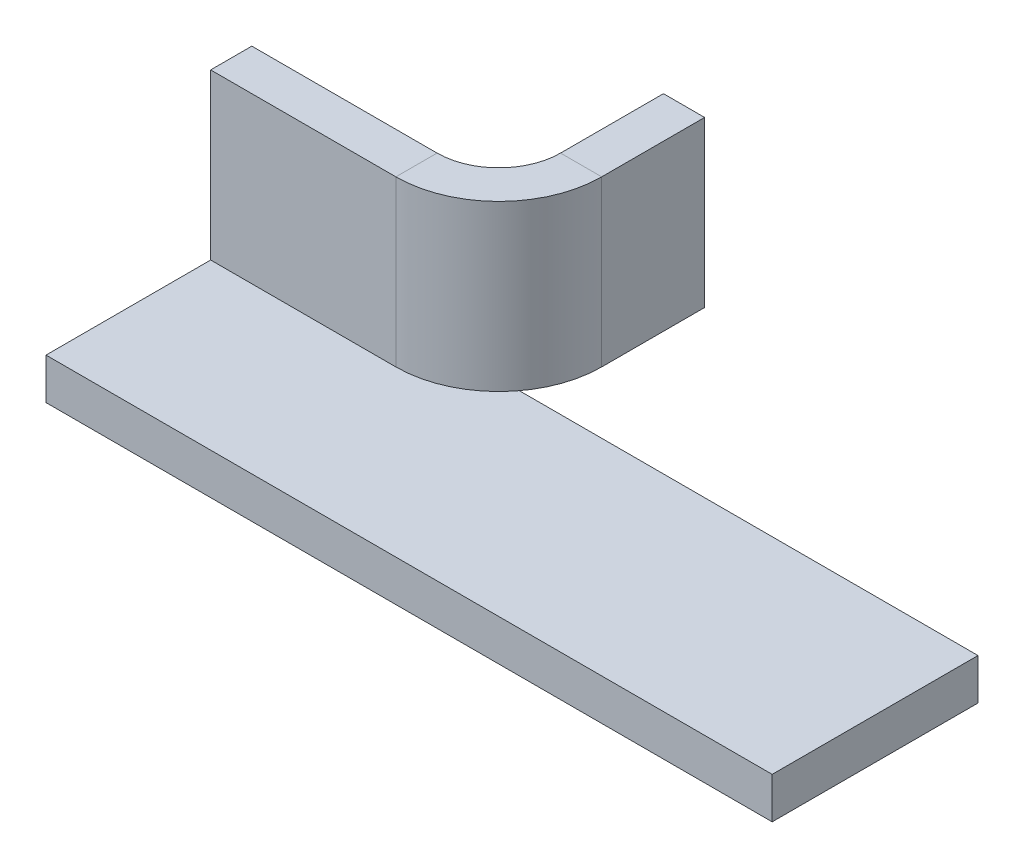
ISO-10303-21;
HEADER;
FILE_DESCRIPTION(('STEP AP214'),'2;1');
FILE_NAME('part.step','',(''),(''),'','','');
FILE_SCHEMA(('AUTOMOTIVE_DESIGN { 1 0 10303 214 1 1 1 1 }'));
ENDSEC;
DATA;
#1=APPLICATION_CONTEXT('core data for automotive mechanical design processes');
#2=APPLICATION_PROTOCOL_DEFINITION('international standard','automotive_design',2000,#1);
#3=PRODUCT_CONTEXT('',#1,'mechanical');
#4=PRODUCT('Part','Part','',(#3));
#5=PRODUCT_RELATED_PRODUCT_CATEGORY('part','',(#4));
#6=PRODUCT_DEFINITION_FORMATION('','',#4);
#7=PRODUCT_DEFINITION_CONTEXT('part definition',#1,'design');
#8=PRODUCT_DEFINITION('design','',#6,#7);
#9=PRODUCT_DEFINITION_SHAPE('','',#8);
#10=(LENGTH_UNIT() NAMED_UNIT(*) SI_UNIT(.MILLI.,.METRE.));
#11=(NAMED_UNIT(*) PLANE_ANGLE_UNIT() SI_UNIT($,.RADIAN.));
#12=(NAMED_UNIT(*) SI_UNIT($,.STERADIAN.) SOLID_ANGLE_UNIT());
#13=UNCERTAINTY_MEASURE_WITH_UNIT(LENGTH_MEASURE(1.E-05),#10,'distance_accuracy_value','');
#14=(GEOMETRIC_REPRESENTATION_CONTEXT(3) GLOBAL_UNCERTAINTY_ASSIGNED_CONTEXT((#13)) GLOBAL_UNIT_ASSIGNED_CONTEXT((#10,
#11,#12)) REPRESENTATION_CONTEXT('',''));
#15=CARTESIAN_POINT('',(0.,0.,0.));
#16=DIRECTION('',(0.,0.,1.));
#17=DIRECTION('',(1.,0.,0.));
#18=AXIS2_PLACEMENT_3D('',#15,#16,#17);
#19=CARTESIAN_POINT('',(12.,8.,-3.));
#20=DIRECTION('',(0.,1.,0.));
#21=DIRECTION('',(0.,0.,1.));
#22=AXIS2_PLACEMENT_3D('',#19,#20,#21);
#23=PLANE('',#22);
#24=DIRECTION('',(1.,0.,0.));
#25=VECTOR('',#24,1.);
#26=CARTESIAN_POINT('',(12.,8.,-3.));
#27=LINE('',#26,#25);
#28=CARTESIAN_POINT('',(12.,8.,-3.));
#29=VERTEX_POINT('',#28);
#30=CARTESIAN_POINT('',(14.,8.,-3.));
#31=VERTEX_POINT('',#30);
#32=EDGE_CURVE('E13',#29,#31,#27,.T.);
#33=ORIENTED_EDGE('',*,*,#32,.F.);
#34=CARTESIAN_POINT('',(9.,8.,-3.));
#35=DIRECTION('',(0.,-1.,0.));
#36=DIRECTION('',(0.,0.,-1.));
#37=AXIS2_PLACEMENT_3D('',#34,#35,#36);
#38=CIRCLE('',#37,3.);
#39=CARTESIAN_POINT('',(9.,8.,0.));
#40=VERTEX_POINT('',#39);
#41=EDGE_CURVE('E151',#40,#29,#38,.F.);
#42=ORIENTED_EDGE('',*,*,#41,.F.);
#43=DIRECTION('',(0.,0.,-1.));
#44=VECTOR('',#43,1.);
#45=CARTESIAN_POINT('',(9.,8.,2.));
#46=LINE('',#45,#44);
#47=CARTESIAN_POINT('',(9.,8.,2.));
#48=VERTEX_POINT('',#47);
#49=EDGE_CURVE('E64',#48,#40,#46,.T.);
#50=ORIENTED_EDGE('',*,*,#49,.F.);
#51=CARTESIAN_POINT('',(9.,8.,-3.));
#52=DIRECTION('',(0.,1.,0.));
#53=DIRECTION('',(1.,0.,0.));
#54=AXIS2_PLACEMENT_3D('',#51,#52,#53);
#55=CIRCLE('',#54,5.);
#56=EDGE_CURVE('E143',#48,#31,#55,.T.);
#57=ORIENTED_EDGE('',*,*,#56,.T.);
#58=EDGE_LOOP('',(#33,#42,#50,#57));
#59=FACE_BOUND('',#58,.T.);
#60=ADVANCED_FACE('F54',(#59),#23,.T.);
#61=CARTESIAN_POINT('',(9.,8.,2.));
#62=DIRECTION('',(0.,1.,0.));
#63=DIRECTION('',(0.,0.,1.));
#64=AXIS2_PLACEMENT_3D('',#61,#62,#63);
#65=PLANE('',#64);
#66=DIRECTION('',(0.,0.,-1.));
#67=VECTOR('',#66,1.);
#68=CARTESIAN_POINT('',(12.,8.,0.));
#69=LINE('',#68,#67);
#70=CARTESIAN_POINT('',(12.,8.,-8.));
#71=VERTEX_POINT('',#70);
#72=EDGE_CURVE('E201',#29,#71,#69,.T.);
#73=ORIENTED_EDGE('',*,*,#72,.F.);
#74=ORIENTED_EDGE('',*,*,#32,.T.);
#75=DIRECTION('',(0.,0.,-1.));
#76=VECTOR('',#75,1.);
#77=CARTESIAN_POINT('',(14.,8.,0.));
#78=LINE('',#77,#76);
#79=CARTESIAN_POINT('',(14.,8.,-8.));
#80=VERTEX_POINT('',#79);
#81=EDGE_CURVE('E111',#31,#80,#78,.T.);
#82=ORIENTED_EDGE('',*,*,#81,.T.);
#83=DIRECTION('',(1.,0.,0.));
#84=VECTOR('',#83,1.);
#85=CARTESIAN_POINT('',(12.,8.,-8.));
#86=LINE('',#85,#84);
#87=EDGE_CURVE('E356',#71,#80,#86,.T.);
#88=ORIENTED_EDGE('',*,*,#87,.F.);
#89=EDGE_LOOP('',(#73,#74,#82,#88));
#90=FACE_BOUND('',#89,.T.);
#91=ADVANCED_FACE('F209',(#90),#65,.T.);
#92=CARTESIAN_POINT('',(9.,0.,0.));
#93=DIRECTION('',(0.,-1.,0.));
#94=DIRECTION('',(0.,0.,-1.));
#95=AXIS2_PLACEMENT_3D('',#92,#93,#94);
#96=PLANE('',#95);
#97=DIRECTION('',(0.,0.,1.));
#98=VECTOR('',#97,1.);
#99=CARTESIAN_POINT('',(9.,0.,0.));
#100=LINE('',#99,#98);
#101=CARTESIAN_POINT('',(9.,0.,0.));
#102=VERTEX_POINT('',#101);
#103=CARTESIAN_POINT('',(9.,0.,2.));
#104=VERTEX_POINT('',#103);
#105=EDGE_CURVE('E96',#102,#104,#100,.T.);
#106=ORIENTED_EDGE('',*,*,#105,.F.);
#107=CARTESIAN_POINT('',(9.,0.,-3.));
#108=DIRECTION('',(0.,-1.,0.));
#109=DIRECTION('',(0.,0.,-1.));
#110=AXIS2_PLACEMENT_3D('',#107,#108,#109);
#111=CIRCLE('',#110,3.);
#112=CARTESIAN_POINT('',(12.,0.,-3.));
#113=VERTEX_POINT('',#112);
#114=EDGE_CURVE('E170',#102,#113,#111,.F.);
#115=ORIENTED_EDGE('',*,*,#114,.T.);
#116=DIRECTION('',(-1.,0.,0.));
#117=VECTOR('',#116,1.);
#118=CARTESIAN_POINT('',(14.,0.,-3.));
#119=LINE('',#118,#117);
#120=CARTESIAN_POINT('',(14.,0.,-3.));
#121=VERTEX_POINT('',#120);
#122=EDGE_CURVE('E102',#121,#113,#119,.T.);
#123=ORIENTED_EDGE('',*,*,#122,.F.);
#124=CARTESIAN_POINT('',(9.,0.,-3.));
#125=DIRECTION('',(0.,1.,0.));
#126=DIRECTION('',(1.,0.,0.));
#127=AXIS2_PLACEMENT_3D('',#124,#125,#126);
#128=CIRCLE('',#127,5.);
#129=EDGE_CURVE('E172',#104,#121,#128,.T.);
#130=ORIENTED_EDGE('',*,*,#129,.F.);
#131=EDGE_LOOP('',(#106,#115,#123,#130));
#132=FACE_BOUND('',#131,.T.);
#133=ADVANCED_FACE('F210',(#132),#96,.T.);
#134=CARTESIAN_POINT('',(14.,0.,-3.));
#135=DIRECTION('',(0.,-1.,0.));
#136=DIRECTION('',(0.,0.,-1.));
#137=AXIS2_PLACEMENT_3D('',#134,#135,#136);
#138=PLANE('',#137);
#139=DIRECTION('',(1.,0.,0.));
#140=VECTOR('',#139,1.);
#141=CARTESIAN_POINT('',(0.,0.,0.));
#142=LINE('',#141,#140);
#143=CARTESIAN_POINT('',(0.,0.,0.));
#144=VERTEX_POINT('',#143);
#145=EDGE_CURVE('E169',#144,#102,#142,.T.);
#146=ORIENTED_EDGE('',*,*,#145,.T.);
#147=ORIENTED_EDGE('',*,*,#105,.T.);
#148=DIRECTION('',(1.,0.,0.));
#149=VECTOR('',#148,1.);
#150=CARTESIAN_POINT('',(0.,0.,2.));
#151=LINE('',#150,#149);
#152=CARTESIAN_POINT('',(0.,0.,2.));
#153=VERTEX_POINT('',#152);
#154=EDGE_CURVE('E175',#153,#104,#151,.T.);
#155=ORIENTED_EDGE('',*,*,#154,.F.);
#156=DIRECTION('',(0.,0.,-1.));
#157=VECTOR('',#156,1.);
#158=CARTESIAN_POINT('',(0.,0.,2.));
#159=LINE('',#158,#157);
#160=EDGE_CURVE('E135',#153,#144,#159,.T.);
#161=ORIENTED_EDGE('',*,*,#160,.T.);
#162=EDGE_LOOP('',(#146,#147,#155,#161));
#163=FACE_BOUND('',#162,.T.);
#164=ADVANCED_FACE('F204',(#163),#138,.T.);
#165=CARTESIAN_POINT('',(14.,8.,0.));
#166=DIRECTION('',(-1.,0.,0.));
#167=DIRECTION('',(0.,0.,1.));
#168=AXIS2_PLACEMENT_3D('',#165,#166,#167);
#169=PLANE('',#168);
#170=DIRECTION('',(0.,0.,-1.));
#171=VECTOR('',#170,1.);
#172=CARTESIAN_POINT('',(14.,0.,0.));
#173=LINE('',#172,#171);
#174=CARTESIAN_POINT('',(14.,0.,-8.));
#175=VERTEX_POINT('',#174);
#176=EDGE_CURVE('E159',#121,#175,#173,.T.);
#177=ORIENTED_EDGE('',*,*,#176,.T.);
#178=DIRECTION('',(0.,-1.,0.));
#179=VECTOR('',#178,1.);
#180=CARTESIAN_POINT('',(14.,8.,-8.));
#181=LINE('',#180,#179);
#182=EDGE_CURVE('E189',#80,#175,#181,.T.);
#183=ORIENTED_EDGE('',*,*,#182,.F.);
#184=ORIENTED_EDGE('',*,*,#81,.F.);
#185=DIRECTION('',(0.,-1.,0.));
#186=VECTOR('',#185,1.);
#187=CARTESIAN_POINT('',(14.,8.,-3.));
#188=LINE('',#187,#186);
#189=EDGE_CURVE('E157',#31,#121,#188,.T.);
#190=ORIENTED_EDGE('',*,*,#189,.T.);
#191=EDGE_LOOP('',(#177,#183,#184,#190));
#192=FACE_BOUND('',#191,.T.);
#193=ADVANCED_FACE('F213',(#192),#169,.F.);
#194=CARTESIAN_POINT('',(12.,8.,-8.));
#195=DIRECTION('',(0.,0.,-1.));
#196=DIRECTION('',(-1.,0.,0.));
#197=AXIS2_PLACEMENT_3D('',#194,#195,#196);
#198=PLANE('',#197);
#199=DIRECTION('',(1.,0.,0.));
#200=VECTOR('',#199,1.);
#201=CARTESIAN_POINT('',(12.,0.,-8.));
#202=LINE('',#201,#200);
#203=CARTESIAN_POINT('',(12.,0.,-8.));
#204=VERTEX_POINT('',#203);
#205=EDGE_CURVE('E163',#204,#175,#202,.T.);
#206=ORIENTED_EDGE('',*,*,#205,.F.);
#207=DIRECTION('',(0.,-1.,0.));
#208=VECTOR('',#207,1.);
#209=CARTESIAN_POINT('',(12.,8.,-8.));
#210=LINE('',#209,#208);
#211=EDGE_CURVE('E187',#71,#204,#210,.T.);
#212=ORIENTED_EDGE('',*,*,#211,.F.);
#213=ORIENTED_EDGE('',*,*,#87,.T.);
#214=ORIENTED_EDGE('',*,*,#182,.T.);
#215=EDGE_LOOP('',(#206,#212,#213,#214));
#216=FACE_BOUND('',#215,.T.);
#217=ADVANCED_FACE('F247',(#216),#198,.T.);
#218=CARTESIAN_POINT('',(12.,8.,0.));
#219=DIRECTION('',(-1.,0.,0.));
#220=DIRECTION('',(0.,0.,1.));
#221=AXIS2_PLACEMENT_3D('',#218,#219,#220);
#222=PLANE('',#221);
#223=DIRECTION('',(0.,0.,-1.));
#224=VECTOR('',#223,1.);
#225=CARTESIAN_POINT('',(12.,0.,0.));
#226=LINE('',#225,#224);
#227=EDGE_CURVE('E165',#113,#204,#226,.T.);
#228=ORIENTED_EDGE('',*,*,#227,.F.);
#229=DIRECTION('',(0.,-1.,0.));
#230=VECTOR('',#229,1.);
#231=CARTESIAN_POINT('',(12.,8.,-3.));
#232=LINE('',#231,#230);
#233=EDGE_CURVE('E182',#29,#113,#232,.T.);
#234=ORIENTED_EDGE('',*,*,#233,.F.);
#235=ORIENTED_EDGE('',*,*,#72,.T.);
#236=ORIENTED_EDGE('',*,*,#211,.T.);
#237=EDGE_LOOP('',(#228,#234,#235,#236));
#238=FACE_BOUND('',#237,.T.);
#239=ADVANCED_FACE('F256',(#238),#222,.T.);
#240=CARTESIAN_POINT('',(9.,8.,-3.));
#241=DIRECTION('',(0.,-1.,0.));
#242=DIRECTION('',(0.,0.,-1.));
#243=AXIS2_PLACEMENT_3D('',#240,#241,#242);
#244=CYLINDRICAL_SURFACE('',#243,3.);
#245=ORIENTED_EDGE('',*,*,#114,.F.);
#246=DIRECTION('',(0.,-1.,0.));
#247=VECTOR('',#246,1.);
#248=CARTESIAN_POINT('',(9.,8.,0.));
#249=LINE('',#248,#247);
#250=EDGE_CURVE('E179',#40,#102,#249,.T.);
#251=ORIENTED_EDGE('',*,*,#250,.F.);
#252=ORIENTED_EDGE('',*,*,#41,.T.);
#253=ORIENTED_EDGE('',*,*,#233,.T.);
#254=EDGE_LOOP('',(#245,#251,#252,#253));
#255=FACE_BOUND('',#254,.T.);
#256=ADVANCED_FACE('F196',(#255),#244,.F.);
#257=CARTESIAN_POINT('',(0.,8.,0.));
#258=DIRECTION('',(0.,0.,-1.));
#259=DIRECTION('',(-1.,0.,0.));
#260=AXIS2_PLACEMENT_3D('',#257,#258,#259);
#261=PLANE('',#260);
#262=ORIENTED_EDGE('',*,*,#145,.F.);
#263=DIRECTION('',(0.,-1.,0.));
#264=VECTOR('',#263,1.);
#265=CARTESIAN_POINT('',(0.,8.,0.));
#266=LINE('',#265,#264);
#267=CARTESIAN_POINT('',(0.,8.,0.));
#268=VERTEX_POINT('',#267);
#269=EDGE_CURVE('E132',#268,#144,#266,.T.);
#270=ORIENTED_EDGE('',*,*,#269,.F.);
#271=DIRECTION('',(1.,0.,0.));
#272=VECTOR('',#271,1.);
#273=CARTESIAN_POINT('',(0.,8.,0.));
#274=LINE('',#273,#272);
#275=EDGE_CURVE('E148',#268,#40,#274,.T.);
#276=ORIENTED_EDGE('',*,*,#275,.T.);
#277=ORIENTED_EDGE('',*,*,#250,.T.);
#278=EDGE_LOOP('',(#262,#270,#276,#277));
#279=FACE_BOUND('',#278,.T.);
#280=ADVANCED_FACE('F202',(#279),#261,.T.);
#281=CARTESIAN_POINT('',(0.,8.,2.));
#282=DIRECTION('',(-1.,0.,0.));
#283=DIRECTION('',(0.,0.,1.));
#284=AXIS2_PLACEMENT_3D('',#281,#282,#283);
#285=PLANE('',#284);
#286=ORIENTED_EDGE('',*,*,#160,.F.);
#287=DIRECTION('',(0.,-1.,0.));
#288=VECTOR('',#287,1.);
#289=CARTESIAN_POINT('',(0.,8.,2.));
#290=LINE('',#289,#288);
#291=CARTESIAN_POINT('',(0.,8.,2.));
#292=VERTEX_POINT('',#291);
#293=EDGE_CURVE('E130',#292,#153,#290,.T.);
#294=ORIENTED_EDGE('',*,*,#293,.F.);
#295=DIRECTION('',(0.,0.,-1.));
#296=VECTOR('',#295,1.);
#297=CARTESIAN_POINT('',(0.,8.,2.));
#298=LINE('',#297,#296);
#299=EDGE_CURVE('E134',#292,#268,#298,.T.);
#300=ORIENTED_EDGE('',*,*,#299,.T.);
#301=ORIENTED_EDGE('',*,*,#269,.T.);
#302=EDGE_LOOP('',(#286,#294,#300,#301));
#303=FACE_BOUND('',#302,.T.);
#304=ADVANCED_FACE('F126',(#303),#285,.T.);
#305=CARTESIAN_POINT('',(0.,8.,2.));
#306=DIRECTION('',(0.,0.,-1.));
#307=DIRECTION('',(-1.,0.,0.));
#308=AXIS2_PLACEMENT_3D('',#305,#306,#307);
#309=PLANE('',#308);
#310=ORIENTED_EDGE('',*,*,#154,.T.);
#311=DIRECTION('',(0.,-1.,0.));
#312=VECTOR('',#311,1.);
#313=CARTESIAN_POINT('',(9.,8.,2.));
#314=LINE('',#313,#312);
#315=EDGE_CURVE('E136',#48,#104,#314,.T.);
#316=ORIENTED_EDGE('',*,*,#315,.F.);
#317=DIRECTION('',(1.,0.,0.));
#318=VECTOR('',#317,1.);
#319=CARTESIAN_POINT('',(0.,8.,2.));
#320=LINE('',#319,#318);
#321=EDGE_CURVE('E140',#292,#48,#320,.T.);
#322=ORIENTED_EDGE('',*,*,#321,.F.);
#323=ORIENTED_EDGE('',*,*,#293,.T.);
#324=EDGE_LOOP('',(#310,#316,#322,#323));
#325=FACE_BOUND('',#324,.T.);
#326=ADVANCED_FACE('F142',(#325),#309,.F.);
#327=CARTESIAN_POINT('',(9.,8.,-3.));
#328=DIRECTION('',(0.,-1.,0.));
#329=DIRECTION('',(0.,0.,-1.));
#330=AXIS2_PLACEMENT_3D('',#327,#328,#329);
#331=CYLINDRICAL_SURFACE('',#330,5.);
#332=ORIENTED_EDGE('',*,*,#129,.T.);
#333=ORIENTED_EDGE('',*,*,#189,.F.);
#334=ORIENTED_EDGE('',*,*,#56,.F.);
#335=ORIENTED_EDGE('',*,*,#315,.T.);
#336=EDGE_LOOP('',(#332,#333,#334,#335));
#337=FACE_BOUND('',#336,.T.);
#338=ADVANCED_FACE('F205',(#337),#331,.T.);
#339=CARTESIAN_POINT('',(9.,8.,-3.));
#340=DIRECTION('',(0.,-1.,0.));
#341=DIRECTION('',(-1.,0.,0.));
#342=AXIS2_PLACEMENT_3D('',#339,#340,#341);
#343=PLANE('',#342);
#344=ORIENTED_EDGE('',*,*,#321,.T.);
#345=ORIENTED_EDGE('',*,*,#49,.T.);
#346=ORIENTED_EDGE('',*,*,#275,.F.);
#347=ORIENTED_EDGE('',*,*,#299,.F.);
#348=EDGE_LOOP('',(#344,#345,#346,#347));
#349=FACE_BOUND('',#348,.T.);
#350=ADVANCED_FACE('F149',(#349),#343,.F.);
#351=CARTESIAN_POINT('',(9.,0.,-3.));
#352=DIRECTION('',(0.,-1.,0.));
#353=DIRECTION('',(-1.,0.,0.));
#354=AXIS2_PLACEMENT_3D('',#351,#352,#353);
#355=PLANE('',#354);
#356=ORIENTED_EDGE('',*,*,#176,.F.);
#357=ORIENTED_EDGE('',*,*,#122,.T.);
#358=ORIENTED_EDGE('',*,*,#227,.T.);
#359=ORIENTED_EDGE('',*,*,#205,.T.);
#360=EDGE_LOOP('',(#356,#357,#358,#359));
#361=FACE_BOUND('',#360,.T.);
#362=ADVANCED_FACE('F323',(#361),#355,.T.);
#363=CLOSED_SHELL('',(#60,#91,#133,#164,#193,#217,#239,#256,#280,#304,#326,#338,#350,#362));
#364=MANIFOLD_SOLID_BREP('B2_NOT_SHOWN',#363);
#365=CARTESIAN_POINT('',(18.2831853071796,3.,10.));
#366=DIRECTION('',(0.,0.,1.));
#367=DIRECTION('',(0.,-1.,0.));
#368=AXIS2_PLACEMENT_3D('',#365,#366,#367);
#369=PLANE('',#368);
#370=DIRECTION('',(1.,0.,0.));
#371=VECTOR('',#370,1.);
#372=CARTESIAN_POINT('',(20.2831853071796,0.,10.));
#373=LINE('',#372,#371);
#374=CARTESIAN_POINT('',(0.,0.,10.));
#375=VERTEX_POINT('',#374);
#376=CARTESIAN_POINT('',(35.2831853071796,0.,10.));
#377=VERTEX_POINT('',#376);
#378=EDGE_CURVE('E428',#375,#377,#373,.T.);
#379=ORIENTED_EDGE('',*,*,#378,.F.);
#380=DIRECTION('',(0.,1.,0.));
#381=VECTOR('',#380,1.);
#382=CARTESIAN_POINT('',(0.,-2.,10.));
#383=LINE('',#382,#381);
#384=CARTESIAN_POINT('',(0.,-2.,10.));
#385=VERTEX_POINT('',#384);
#386=EDGE_CURVE('E422',#385,#375,#383,.T.);
#387=ORIENTED_EDGE('',*,*,#386,.F.);
#388=DIRECTION('',(1.,0.,0.));
#389=VECTOR('',#388,1.);
#390=CARTESIAN_POINT('',(20.2831853071796,-2.,10.));
#391=LINE('',#390,#389);
#392=CARTESIAN_POINT('',(35.2831853071796,-2.,10.));
#393=VERTEX_POINT('',#392);
#394=EDGE_CURVE('E409',#385,#393,#391,.T.);
#395=ORIENTED_EDGE('',*,*,#394,.T.);
#396=DIRECTION('',(0.,-1.,0.));
#397=VECTOR('',#396,1.);
#398=CARTESIAN_POINT('',(35.2831853071796,0.,10.));
#399=LINE('',#398,#397);
#400=EDGE_CURVE('E412',#377,#393,#399,.T.);
#401=ORIENTED_EDGE('',*,*,#400,.F.);
#402=EDGE_LOOP('',(#379,#387,#395,#401));
#403=FACE_BOUND('',#402,.T.);
#404=ADVANCED_FACE('F370',(#403),#369,.T.);
#405=CARTESIAN_POINT('',(20.2831853071796,-2.,10.));
#406=DIRECTION('',(0.,1.,0.));
#407=DIRECTION('',(0.,0.,1.));
#408=AXIS2_PLACEMENT_3D('',#405,#406,#407);
#409=PLANE('',#408);
#410=DIRECTION('',(1.,0.,0.));
#411=VECTOR('',#410,1.);
#412=CARTESIAN_POINT('',(20.2831853071796,-2.,0.));
#413=LINE('',#412,#411);
#414=CARTESIAN_POINT('',(0.,-2.,0.));
#415=VERTEX_POINT('',#414);
#416=CARTESIAN_POINT('',(35.2831853071796,-2.,0.));
#417=VERTEX_POINT('',#416);
#418=EDGE_CURVE('E399',#415,#417,#413,.T.);
#419=ORIENTED_EDGE('',*,*,#418,.T.);
#420=DIRECTION('',(0.,0.,-1.));
#421=VECTOR('',#420,1.);
#422=CARTESIAN_POINT('',(35.2831853071796,-2.,10.));
#423=LINE('',#422,#421);
#424=EDGE_CURVE('E52',#393,#417,#423,.T.);
#425=ORIENTED_EDGE('',*,*,#424,.F.);
#426=ORIENTED_EDGE('',*,*,#394,.F.);
#427=DIRECTION('',(0.,0.,-1.));
#428=VECTOR('',#427,1.);
#429=CARTESIAN_POINT('',(0.,-2.,10.));
#430=LINE('',#429,#428);
#431=EDGE_CURVE('E414',#385,#415,#430,.T.);
#432=ORIENTED_EDGE('',*,*,#431,.T.);
#433=EDGE_LOOP('',(#419,#425,#426,#432));
#434=FACE_BOUND('',#433,.T.);
#435=ADVANCED_FACE('F408',(#434),#409,.F.);
#436=CARTESIAN_POINT('',(35.2831853071796,0.,10.));
#437=DIRECTION('',(1.,0.,0.));
#438=DIRECTION('',(0.,0.,1.));
#439=AXIS2_PLACEMENT_3D('',#436,#437,#438);
#440=PLANE('',#439);
#441=DIRECTION('',(0.,-1.,0.));
#442=VECTOR('',#441,1.);
#443=CARTESIAN_POINT('',(35.2831853071796,0.,0.));
#444=LINE('',#443,#442);
#445=CARTESIAN_POINT('',(35.2831853071796,0.,0.));
#446=VERTEX_POINT('',#445);
#447=EDGE_CURVE('E436',#446,#417,#444,.T.);
#448=ORIENTED_EDGE('',*,*,#447,.F.);
#449=DIRECTION('',(0.,0.,-1.));
#450=VECTOR('',#449,1.);
#451=CARTESIAN_POINT('',(35.2831853071796,0.,10.));
#452=LINE('',#451,#450);
#453=EDGE_CURVE('E376',#377,#446,#452,.T.);
#454=ORIENTED_EDGE('',*,*,#453,.F.);
#455=ORIENTED_EDGE('',*,*,#400,.T.);
#456=ORIENTED_EDGE('',*,*,#424,.T.);
#457=EDGE_LOOP('',(#448,#454,#455,#456));
#458=FACE_BOUND('',#457,.T.);
#459=ADVANCED_FACE('F439',(#458),#440,.T.);
#460=CARTESIAN_POINT('',(0.,0.,10.));
#461=DIRECTION('',(0.,1.,0.));
#462=DIRECTION('',(0.,0.,1.));
#463=AXIS2_PLACEMENT_3D('',#460,#461,#462);
#464=PLANE('',#463);
#465=DIRECTION('',(1.,0.,0.));
#466=VECTOR('',#465,1.);
#467=CARTESIAN_POINT('',(20.2831853071796,0.,0.));
#468=LINE('',#467,#466);
#469=CARTESIAN_POINT('',(0.,0.,0.));
#470=VERTEX_POINT('',#469);
#471=EDGE_CURVE('E416',#470,#446,#468,.T.);
#472=ORIENTED_EDGE('',*,*,#471,.F.);
#473=DIRECTION('',(0.,0.,-1.));
#474=VECTOR('',#473,1.);
#475=CARTESIAN_POINT('',(0.,0.,10.));
#476=LINE('',#475,#474);
#477=EDGE_CURVE('E426',#375,#470,#476,.T.);
#478=ORIENTED_EDGE('',*,*,#477,.F.);
#479=ORIENTED_EDGE('',*,*,#378,.T.);
#480=ORIENTED_EDGE('',*,*,#453,.T.);
#481=EDGE_LOOP('',(#472,#478,#479,#480));
#482=FACE_BOUND('',#481,.T.);
#483=ADVANCED_FACE('F367',(#482),#464,.T.);
#484=CARTESIAN_POINT('',(23.2831853071796,3.,0.));
#485=DIRECTION('',(0.,0.,-1.));
#486=DIRECTION('',(0.,1.,0.));
#487=AXIS2_PLACEMENT_3D('',#484,#485,#486);
#488=PLANE('',#487);
#489=ORIENTED_EDGE('',*,*,#418,.F.);
#490=DIRECTION('',(0.,1.,0.));
#491=VECTOR('',#490,1.);
#492=CARTESIAN_POINT('',(0.,-2.,0.));
#493=LINE('',#492,#491);
#494=EDGE_CURVE('E421',#415,#470,#493,.T.);
#495=ORIENTED_EDGE('',*,*,#494,.T.);
#496=ORIENTED_EDGE('',*,*,#471,.T.);
#497=ORIENTED_EDGE('',*,*,#447,.T.);
#498=EDGE_LOOP('',(#489,#495,#496,#497));
#499=FACE_BOUND('',#498,.T.);
#500=ADVANCED_FACE('F441',(#499),#488,.T.);
#501=CARTESIAN_POINT('',(0.,-2.,10.));
#502=DIRECTION('',(-1.,0.,0.));
#503=DIRECTION('',(0.,0.,1.));
#504=AXIS2_PLACEMENT_3D('',#501,#502,#503);
#505=PLANE('',#504);
#506=ORIENTED_EDGE('',*,*,#494,.F.);
#507=ORIENTED_EDGE('',*,*,#431,.F.);
#508=ORIENTED_EDGE('',*,*,#386,.T.);
#509=ORIENTED_EDGE('',*,*,#477,.T.);
#510=EDGE_LOOP('',(#506,#507,#508,#509));
#511=FACE_BOUND('',#510,.T.);
#512=ADVANCED_FACE('F420',(#511),#505,.T.);
#513=CLOSED_SHELL('',(#404,#435,#459,#483,#500,#512));
#514=MANIFOLD_SOLID_BREP('B7',#513);
#515=ADVANCED_BREP_SHAPE_REPRESENTATION('',(#18,#364,#514),#14);
#516=SHAPE_DEFINITION_REPRESENTATION(#9,#515);
ENDSEC;
END-ISO-10303-21;
